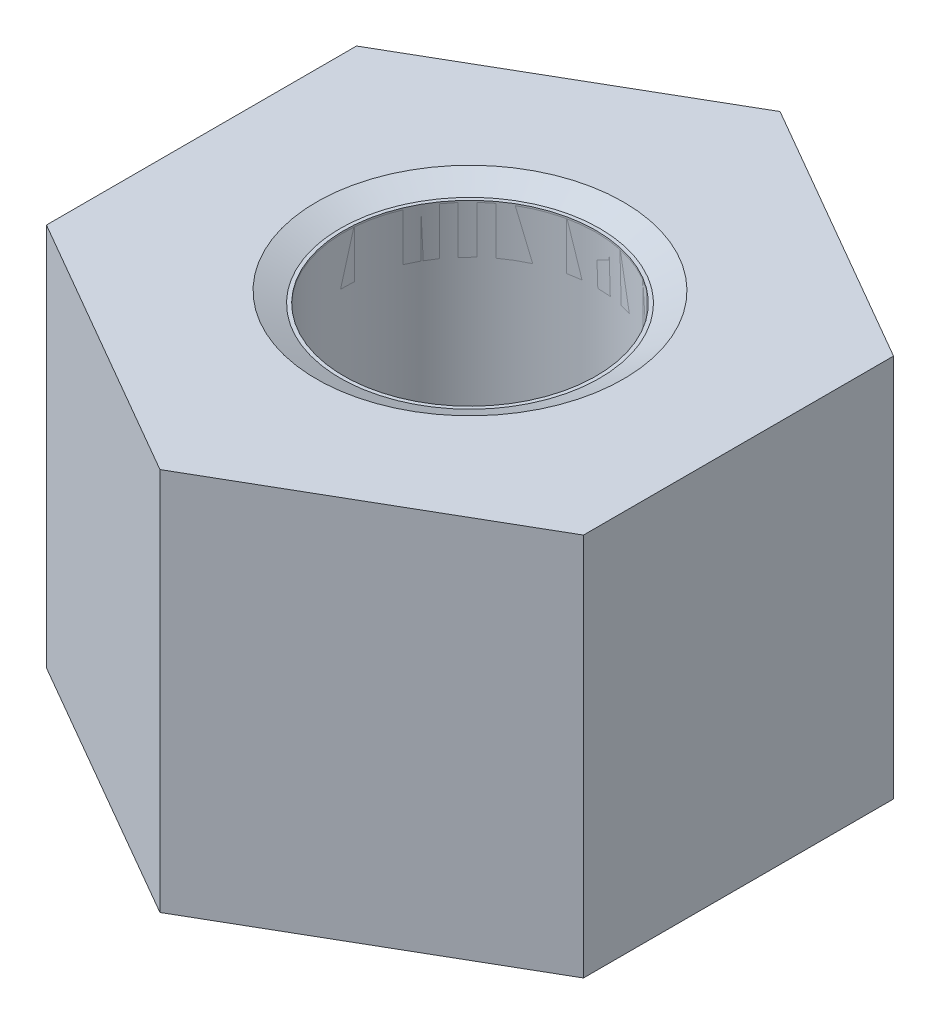
ISO-10303-21;
HEADER;
FILE_DESCRIPTION(('STEP AP214'),'2;1');
FILE_NAME('part.step','',(''),(''),'','','');
FILE_SCHEMA(('AUTOMOTIVE_DESIGN { 1 0 10303 214 1 1 1 1 }'));
ENDSEC;
DATA;
#1=APPLICATION_CONTEXT('core data for automotive mechanical design processes');
#2=APPLICATION_PROTOCOL_DEFINITION('international standard','automotive_design',2000,#1);
#3=PRODUCT_CONTEXT('',#1,'mechanical');
#4=PRODUCT('Part','Part','',(#3));
#5=PRODUCT_RELATED_PRODUCT_CATEGORY('part','',(#4));
#6=PRODUCT_DEFINITION_FORMATION('','',#4);
#7=PRODUCT_DEFINITION_CONTEXT('part definition',#1,'design');
#8=PRODUCT_DEFINITION('design','',#6,#7);
#9=PRODUCT_DEFINITION_SHAPE('','',#8);
#10=(LENGTH_UNIT() NAMED_UNIT(*) SI_UNIT(.MILLI.,.METRE.));
#11=(NAMED_UNIT(*) PLANE_ANGLE_UNIT() SI_UNIT($,.RADIAN.));
#12=(NAMED_UNIT(*) SI_UNIT($,.STERADIAN.) SOLID_ANGLE_UNIT());
#13=UNCERTAINTY_MEASURE_WITH_UNIT(LENGTH_MEASURE(1.E-05),#10,'distance_accuracy_value','');
#14=(GEOMETRIC_REPRESENTATION_CONTEXT(3) GLOBAL_UNCERTAINTY_ASSIGNED_CONTEXT((#13)) GLOBAL_UNIT_ASSIGNED_CONTEXT((#10,
#11,#12)) REPRESENTATION_CONTEXT('',''));
#15=CARTESIAN_POINT('',(0.,0.,0.));
#16=DIRECTION('',(0.,0.,1.));
#17=DIRECTION('',(1.,0.,0.));
#18=AXIS2_PLACEMENT_3D('',#15,#16,#17);
#19=CARTESIAN_POINT('',(0.,6.69078333333333,0.));
#20=DIRECTION('',(0.,-1.,0.));
#21=DIRECTION('',(0.,0.,-1.));
#22=AXIS2_PLACEMENT_3D('',#19,#20,#21);
#23=CYLINDRICAL_SURFACE('',#22,2.60990835569695);
#24=CARTESIAN_POINT('',(0.,6.69078333333333,0.));
#25=DIRECTION('',(0.,-1.,0.));
#26=DIRECTION('',(0.,0.,-1.));
#27=AXIS2_PLACEMENT_3D('',#24,#25,#26);
#28=CIRCLE('',#27,2.60990835569695);
#29=CARTESIAN_POINT('',(0.,6.69078333333333,-2.60990835569695));
#30=VERTEX_POINT('',#29);
#31=EDGE_CURVE('E11',#30,#30,#28,.T.);
#32=ORIENTED_EDGE('',*,*,#31,.T.);
#33=EDGE_LOOP('',(#32));
#34=FACE_BOUND('',#33,.T.);
#35=CARTESIAN_POINT('',(0.,7.7089,0.));
#36=DIRECTION('',(0.,-1.,0.));
#37=DIRECTION('',(0.,0.,-1.));
#38=AXIS2_PLACEMENT_3D('',#35,#36,#37);
#39=CIRCLE('',#38,2.60990835569695);
#40=CARTESIAN_POINT('',(0.,7.7089,-2.60990835569695));
#41=VERTEX_POINT('',#40);
#42=EDGE_CURVE('E61',#41,#41,#39,.T.);
#43=ORIENTED_EDGE('',*,*,#42,.F.);
#44=EDGE_LOOP('',(#43));
#45=FACE_BOUND('',#44,.T.);
#46=ADVANCED_FACE('F47',(#34,#45),#23,.F.);
#47=CARTESIAN_POINT('',(0.,6.69078333333333,-2.60990835569695));
#48=DIRECTION('',(0.,-1.,0.));
#49=DIRECTION('',(0.,0.,-1.));
#50=AXIS2_PLACEMENT_3D('',#47,#48,#49);
#51=PLANE('',#50);
#52=CARTESIAN_POINT('',(0.,6.69078333333333,0.));
#53=DIRECTION('',(0.,-1.,0.));
#54=DIRECTION('',(0.,0.,-1.));
#55=AXIS2_PLACEMENT_3D('',#52,#53,#54);
#56=CIRCLE('',#55,5.32499377822654);
#57=CARTESIAN_POINT('',(0.,6.69078333333333,-5.32499377822654));
#58=VERTEX_POINT('',#57);
#59=EDGE_CURVE('E53',#58,#58,#56,.T.);
#60=ORIENTED_EDGE('',*,*,#59,.T.);
#61=EDGE_LOOP('',(#60));
#62=FACE_BOUND('',#61,.T.);
#63=ORIENTED_EDGE('',*,*,#31,.F.);
#64=EDGE_LOOP('',(#63));
#65=FACE_BOUND('',#64,.T.);
#66=ADVANCED_FACE('F71',(#62,#65),#51,.T.);
#67=CARTESIAN_POINT('',(0.,6.61458333333333,0.));
#68=DIRECTION('',(0.,-1.,0.));
#69=DIRECTION('',(0.,0.,-1.));
#70=AXIS2_PLACEMENT_3D('',#67,#68,#69);
#71=TOROIDAL_SURFACE('',#70,4.23333333333333,1.09431666666667);
#72=CARTESIAN_POINT('',(0.,7.7089,0.));
#73=DIRECTION('',(0.,-1.,0.));
#74=DIRECTION('',(0.,0.,-1.));
#75=AXIS2_PLACEMENT_3D('',#72,#73,#74);
#76=CIRCLE('',#75,4.23333333333333);
#77=CARTESIAN_POINT('',(0.,7.7089,-4.23333333333333));
#78=VERTEX_POINT('',#77);
#79=EDGE_CURVE('E57',#78,#78,#76,.T.);
#80=ORIENTED_EDGE('',*,*,#79,.T.);
#81=EDGE_LOOP('',(#80));
#82=FACE_BOUND('',#81,.T.);
#83=ORIENTED_EDGE('',*,*,#59,.F.);
#84=EDGE_LOOP('',(#83));
#85=FACE_BOUND('',#84,.T.);
#86=ADVANCED_FACE('F75',(#82,#85),#71,.T.);
#87=CARTESIAN_POINT('',(0.,7.7089,-4.23333333333333));
#88=DIRECTION('',(0.,1.,0.));
#89=DIRECTION('',(0.,0.,1.));
#90=AXIS2_PLACEMENT_3D('',#87,#88,#89);
#91=PLANE('',#90);
#92=ORIENTED_EDGE('',*,*,#42,.T.);
#93=EDGE_LOOP('',(#92));
#94=FACE_BOUND('',#93,.T.);
#95=ORIENTED_EDGE('',*,*,#79,.F.);
#96=EDGE_LOOP('',(#95));
#97=FACE_BOUND('',#96,.T.);
#98=ADVANCED_FACE('F67',(#94,#97),#91,.T.);
#99=CLOSED_SHELL('',(#46,#66,#86,#98));
#100=MANIFOLD_SOLID_BREP('B2',#99);
#101=CARTESIAN_POINT('',(5.55625,7.9375,-3.20790243318486));
#102=DIRECTION('',(-0.5,0.,0.866025403784439));
#103=DIRECTION('',(0.866025403784439,0.,0.5));
#104=AXIS2_PLACEMENT_3D('',#101,#102,#103);
#105=PLANE('',#104);
#106=DIRECTION('',(-0.866025403784439,0.,-0.5));
#107=VECTOR('',#106,1.);
#108=CARTESIAN_POINT('',(5.55625,0.,-3.20790243318486));
#109=LINE('',#108,#107);
#110=CARTESIAN_POINT('',(5.55625,0.,-3.20790243318486));
#111=VERTEX_POINT('',#110);
#112=CARTESIAN_POINT('',(0.,0.,-6.41580486636972));
#113=VERTEX_POINT('',#112);
#114=EDGE_CURVE('E198',#111,#113,#109,.T.);
#115=ORIENTED_EDGE('',*,*,#114,.T.);
#116=DIRECTION('',(0.,-1.,0.));
#117=VECTOR('',#116,1.);
#118=CARTESIAN_POINT('',(0.,7.9375,-6.41580486636972));
#119=LINE('',#118,#117);
#120=CARTESIAN_POINT('',(0.,7.9375,-6.41580486636972));
#121=VERTEX_POINT('',#120);
#122=EDGE_CURVE('E45',#121,#113,#119,.T.);
#123=ORIENTED_EDGE('',*,*,#122,.F.);
#124=DIRECTION('',(-0.866025403784439,0.,-0.5));
#125=VECTOR('',#124,1.);
#126=CARTESIAN_POINT('',(5.55625,7.9375,-3.20790243318486));
#127=LINE('',#126,#125);
#128=CARTESIAN_POINT('',(5.55625,7.9375,-3.20790243318486));
#129=VERTEX_POINT('',#128);
#130=EDGE_CURVE('E215',#129,#121,#127,.T.);
#131=ORIENTED_EDGE('',*,*,#130,.F.);
#132=DIRECTION('',(0.,-1.,0.));
#133=VECTOR('',#132,1.);
#134=CARTESIAN_POINT('',(5.55625,7.9375,-3.20790243318486));
#135=LINE('',#134,#133);
#136=EDGE_CURVE('E194',#129,#111,#135,.T.);
#137=ORIENTED_EDGE('',*,*,#136,.T.);
#138=EDGE_LOOP('',(#115,#123,#131,#137));
#139=FACE_BOUND('',#138,.T.);
#140=ADVANCED_FACE('F109',(#139),#105,.F.);
#141=CARTESIAN_POINT('',(0.,7.9375,-6.41580486636972));
#142=DIRECTION('',(0.5,0.,0.866025403784439));
#143=DIRECTION('',(0.866025403784439,0.,-0.5));
#144=AXIS2_PLACEMENT_3D('',#141,#142,#143);
#145=PLANE('',#144);
#146=DIRECTION('',(-0.866025403784439,0.,0.5));
#147=VECTOR('',#146,1.);
#148=CARTESIAN_POINT('',(0.,0.,-6.41580486636972));
#149=LINE('',#148,#147);
#150=CARTESIAN_POINT('',(-5.55625,0.,-3.20790243318486));
#151=VERTEX_POINT('',#150);
#152=EDGE_CURVE('E202',#113,#151,#149,.T.);
#153=ORIENTED_EDGE('',*,*,#152,.T.);
#154=DIRECTION('',(0.,-1.,0.));
#155=VECTOR('',#154,1.);
#156=CARTESIAN_POINT('',(-5.55625,7.9375,-3.20790243318486));
#157=LINE('',#156,#155);
#158=CARTESIAN_POINT('',(-5.55625,7.9375,-3.20790243318486));
#159=VERTEX_POINT('',#158);
#160=EDGE_CURVE('E118',#159,#151,#157,.T.);
#161=ORIENTED_EDGE('',*,*,#160,.F.);
#162=DIRECTION('',(-0.866025403784439,0.,0.5));
#163=VECTOR('',#162,1.);
#164=CARTESIAN_POINT('',(0.,7.9375,-6.41580486636972));
#165=LINE('',#164,#163);
#166=EDGE_CURVE('E163',#121,#159,#165,.T.);
#167=ORIENTED_EDGE('',*,*,#166,.F.);
#168=ORIENTED_EDGE('',*,*,#122,.T.);
#169=EDGE_LOOP('',(#153,#161,#167,#168));
#170=FACE_BOUND('',#169,.T.);
#171=ADVANCED_FACE('F244',(#170),#145,.F.);
#172=CARTESIAN_POINT('',(-5.55625,7.9375,-3.20790243318486));
#173=DIRECTION('',(1.,0.,0.));
#174=DIRECTION('',(0.,0.,-1.));
#175=AXIS2_PLACEMENT_3D('',#172,#173,#174);
#176=PLANE('',#175);
#177=DIRECTION('',(0.,0.,1.));
#178=VECTOR('',#177,1.);
#179=CARTESIAN_POINT('',(-5.55625,0.,-3.20790243318486));
#180=LINE('',#179,#178);
#181=CARTESIAN_POINT('',(-5.55625,0.,3.20790243318486));
#182=VERTEX_POINT('',#181);
#183=EDGE_CURVE('E206',#151,#182,#180,.T.);
#184=ORIENTED_EDGE('',*,*,#183,.T.);
#185=DIRECTION('',(0.,-1.,0.));
#186=VECTOR('',#185,1.);
#187=CARTESIAN_POINT('',(-5.55625,7.9375,3.20790243318486));
#188=LINE('',#187,#186);
#189=CARTESIAN_POINT('',(-5.55625,7.9375,3.20790243318486));
#190=VERTEX_POINT('',#189);
#191=EDGE_CURVE('E187',#190,#182,#188,.T.);
#192=ORIENTED_EDGE('',*,*,#191,.F.);
#193=DIRECTION('',(0.,0.,1.));
#194=VECTOR('',#193,1.);
#195=CARTESIAN_POINT('',(-5.55625,7.9375,-3.20790243318486));
#196=LINE('',#195,#194);
#197=EDGE_CURVE('E176',#159,#190,#196,.T.);
#198=ORIENTED_EDGE('',*,*,#197,.F.);
#199=ORIENTED_EDGE('',*,*,#160,.T.);
#200=EDGE_LOOP('',(#184,#192,#198,#199));
#201=FACE_BOUND('',#200,.T.);
#202=ADVANCED_FACE('F225',(#201),#176,.F.);
#203=CARTESIAN_POINT('',(-5.55625,7.9375,3.20790243318486));
#204=DIRECTION('',(0.5,0.,-0.866025403784438));
#205=DIRECTION('',(-0.866025403784439,0.,-0.5));
#206=AXIS2_PLACEMENT_3D('',#203,#204,#205);
#207=PLANE('',#206);
#208=DIRECTION('',(0.866025403784438,0.,0.5));
#209=VECTOR('',#208,1.);
#210=CARTESIAN_POINT('',(-5.55625,0.,3.20790243318486));
#211=LINE('',#210,#209);
#212=CARTESIAN_POINT('',(0.,0.,6.41580486636972));
#213=VERTEX_POINT('',#212);
#214=EDGE_CURVE('E185',#182,#213,#211,.T.);
#215=ORIENTED_EDGE('',*,*,#214,.T.);
#216=DIRECTION('',(0.,-1.,0.));
#217=VECTOR('',#216,1.);
#218=CARTESIAN_POINT('',(0.,7.9375,6.41580486636972));
#219=LINE('',#218,#217);
#220=CARTESIAN_POINT('',(0.,7.9375,6.41580486636972));
#221=VERTEX_POINT('',#220);
#222=EDGE_CURVE('E182',#221,#213,#219,.T.);
#223=ORIENTED_EDGE('',*,*,#222,.F.);
#224=DIRECTION('',(0.866025403784438,0.,0.5));
#225=VECTOR('',#224,1.);
#226=CARTESIAN_POINT('',(-5.55625,7.9375,3.20790243318486));
#227=LINE('',#226,#225);
#228=EDGE_CURVE('E170',#190,#221,#227,.T.);
#229=ORIENTED_EDGE('',*,*,#228,.F.);
#230=ORIENTED_EDGE('',*,*,#191,.T.);
#231=EDGE_LOOP('',(#215,#223,#229,#230));
#232=FACE_BOUND('',#231,.T.);
#233=ADVANCED_FACE('F183',(#232),#207,.F.);
#234=CARTESIAN_POINT('',(0.,7.9375,6.41580486636972));
#235=DIRECTION('',(-0.5,0.,-0.866025403784439));
#236=DIRECTION('',(-0.866025403784439,0.,0.5));
#237=AXIS2_PLACEMENT_3D('',#234,#235,#236);
#238=PLANE('',#237);
#239=DIRECTION('',(0.866025403784439,0.,-0.5));
#240=VECTOR('',#239,1.);
#241=CARTESIAN_POINT('',(0.,0.,6.41580486636972));
#242=LINE('',#241,#240);
#243=CARTESIAN_POINT('',(5.55625,0.,3.20790243318486));
#244=VERTEX_POINT('',#243);
#245=EDGE_CURVE('E149',#213,#244,#242,.T.);
#246=ORIENTED_EDGE('',*,*,#245,.T.);
#247=DIRECTION('',(0.,-1.,0.));
#248=VECTOR('',#247,1.);
#249=CARTESIAN_POINT('',(5.55625,7.9375,3.20790243318486));
#250=LINE('',#249,#248);
#251=CARTESIAN_POINT('',(5.55625,7.9375,3.20790243318486));
#252=VERTEX_POINT('',#251);
#253=EDGE_CURVE('E188',#252,#244,#250,.T.);
#254=ORIENTED_EDGE('',*,*,#253,.F.);
#255=DIRECTION('',(0.866025403784439,0.,-0.5));
#256=VECTOR('',#255,1.);
#257=CARTESIAN_POINT('',(0.,7.9375,6.41580486636972));
#258=LINE('',#257,#256);
#259=EDGE_CURVE('E174',#221,#252,#258,.T.);
#260=ORIENTED_EDGE('',*,*,#259,.F.);
#261=ORIENTED_EDGE('',*,*,#222,.T.);
#262=EDGE_LOOP('',(#246,#254,#260,#261));
#263=FACE_BOUND('',#262,.T.);
#264=ADVANCED_FACE('F190',(#263),#238,.F.);
#265=CARTESIAN_POINT('',(5.55625,7.9375,3.20790243318486));
#266=DIRECTION('',(-1.,0.,0.));
#267=DIRECTION('',(0.,0.,1.));
#268=AXIS2_PLACEMENT_3D('',#265,#266,#267);
#269=PLANE('',#268);
#270=DIRECTION('',(0.,0.,-1.));
#271=VECTOR('',#270,1.);
#272=CARTESIAN_POINT('',(5.55625,0.,3.20790243318486));
#273=LINE('',#272,#271);
#274=EDGE_CURVE('E155',#244,#111,#273,.T.);
#275=ORIENTED_EDGE('',*,*,#274,.T.);
#276=ORIENTED_EDGE('',*,*,#136,.F.);
#277=DIRECTION('',(0.,0.,-1.));
#278=VECTOR('',#277,1.);
#279=CARTESIAN_POINT('',(5.55625,7.9375,3.20790243318486));
#280=LINE('',#279,#278);
#281=EDGE_CURVE('E126',#252,#129,#280,.T.);
#282=ORIENTED_EDGE('',*,*,#281,.F.);
#283=ORIENTED_EDGE('',*,*,#253,.T.);
#284=EDGE_LOOP('',(#275,#276,#282,#283));
#285=FACE_BOUND('',#284,.T.);
#286=ADVANCED_FACE('F232',(#285),#269,.F.);
#287=CARTESIAN_POINT('',(-5.55625,7.9375,-9.62370729955458));
#288=DIRECTION('',(0.,1.,0.));
#289=DIRECTION('',(0.,0.,1.));
#290=AXIS2_PLACEMENT_3D('',#287,#288,#289);
#291=PLANE('',#290);
#292=CARTESIAN_POINT('',(0.,7.9375,0.));
#293=DIRECTION('',(0.,-1.,0.));
#294=DIRECTION('',(0.,0.,-1.));
#295=AXIS2_PLACEMENT_3D('',#292,#293,#294);
#296=CIRCLE('',#295,3.175);
#297=CARTESIAN_POINT('',(0.,7.9375,-3.175));
#298=VERTEX_POINT('',#297);
#299=EDGE_CURVE('E203',#298,#298,#296,.T.);
#300=ORIENTED_EDGE('',*,*,#299,.T.);
#301=EDGE_LOOP('',(#300));
#302=FACE_BOUND('',#301,.T.);
#303=ORIENTED_EDGE('',*,*,#130,.T.);
#304=ORIENTED_EDGE('',*,*,#166,.T.);
#305=ORIENTED_EDGE('',*,*,#197,.T.);
#306=ORIENTED_EDGE('',*,*,#228,.T.);
#307=ORIENTED_EDGE('',*,*,#259,.T.);
#308=ORIENTED_EDGE('',*,*,#281,.T.);
#309=EDGE_LOOP('',(#303,#304,#305,#306,#307,#308));
#310=FACE_BOUND('',#309,.T.);
#311=ADVANCED_FACE('F172',(#302,#310),#291,.T.);
#312=CARTESIAN_POINT('',(-5.55625,0.,-9.62370729955458));
#313=DIRECTION('',(0.,1.,0.));
#314=DIRECTION('',(0.,0.,1.));
#315=AXIS2_PLACEMENT_3D('',#312,#313,#314);
#316=PLANE('',#315);
#317=CARTESIAN_POINT('',(0.,0.,0.));
#318=DIRECTION('',(0.,-1.,0.));
#319=DIRECTION('',(0.,0.,-1.));
#320=AXIS2_PLACEMENT_3D('',#317,#318,#319);
#321=CIRCLE('',#320,3.175);
#322=CARTESIAN_POINT('',(0.,0.,-3.175));
#323=VERTEX_POINT('',#322);
#324=EDGE_CURVE('E320',#323,#323,#321,.T.);
#325=ORIENTED_EDGE('',*,*,#324,.F.);
#326=EDGE_LOOP('',(#325));
#327=FACE_BOUND('',#326,.T.);
#328=ORIENTED_EDGE('',*,*,#114,.F.);
#329=ORIENTED_EDGE('',*,*,#274,.F.);
#330=ORIENTED_EDGE('',*,*,#245,.F.);
#331=ORIENTED_EDGE('',*,*,#214,.F.);
#332=ORIENTED_EDGE('',*,*,#183,.F.);
#333=ORIENTED_EDGE('',*,*,#152,.F.);
#334=EDGE_LOOP('',(#328,#329,#330,#331,#332,#333));
#335=FACE_BOUND('',#334,.T.);
#336=ADVANCED_FACE('F228',(#327,#335),#316,.F.);
#337=CARTESIAN_POINT('',(0.,7.67399343870209,0.));
#338=DIRECTION('',(0.,1.,0.));
#339=DIRECTION('',(0.,0.,1.));
#340=AXIS2_PLACEMENT_3D('',#337,#338,#339);
#341=CONICAL_SURFACE('',#340,2.60990835569695,1.13446401379632);
#342=ORIENTED_EDGE('',*,*,#299,.F.);
#343=EDGE_LOOP('',(#342));
#344=FACE_BOUND('',#343,.T.);
#345=CARTESIAN_POINT('',(0.,7.67399343870209,0.));
#346=DIRECTION('',(0.,-1.,0.));
#347=DIRECTION('',(0.,0.,-1.));
#348=AXIS2_PLACEMENT_3D('',#345,#346,#347);
#349=CIRCLE('',#348,2.60990835569695);
#350=CARTESIAN_POINT('',(0.,7.67399343870209,-2.60990835569695));
#351=VERTEX_POINT('',#350);
#352=EDGE_CURVE('E324',#351,#351,#349,.T.);
#353=ORIENTED_EDGE('',*,*,#352,.T.);
#354=EDGE_LOOP('',(#353));
#355=FACE_BOUND('',#354,.T.);
#356=ADVANCED_FACE('F281',(#344,#355),#341,.F.);
#357=CARTESIAN_POINT('',(0.,7.9375,0.));
#358=DIRECTION('',(0.,-1.,0.));
#359=DIRECTION('',(0.,0.,-1.));
#360=AXIS2_PLACEMENT_3D('',#357,#358,#359);
#361=CYLINDRICAL_SURFACE('',#360,2.60990835569695);
#362=ORIENTED_EDGE('',*,*,#352,.F.);
#363=EDGE_LOOP('',(#362));
#364=FACE_BOUND('',#363,.T.);
#365=CARTESIAN_POINT('',(0.,0.263506561297913,0.));
#366=DIRECTION('',(0.,-1.,0.));
#367=DIRECTION('',(0.,0.,-1.));
#368=AXIS2_PLACEMENT_3D('',#365,#366,#367);
#369=CIRCLE('',#368,2.60990835569695);
#370=CARTESIAN_POINT('',(0.,0.263506561297913,-2.60990835569695));
#371=VERTEX_POINT('',#370);
#372=EDGE_CURVE('E317',#371,#371,#369,.T.);
#373=ORIENTED_EDGE('',*,*,#372,.T.);
#374=EDGE_LOOP('',(#373));
#375=FACE_BOUND('',#374,.T.);
#376=ADVANCED_FACE('F290',(#364,#375),#361,.F.);
#377=CARTESIAN_POINT('',(0.,0.,0.));
#378=DIRECTION('',(0.,-1.,0.));
#379=DIRECTION('',(0.,0.,-1.));
#380=AXIS2_PLACEMENT_3D('',#377,#378,#379);
#381=CONICAL_SURFACE('',#380,3.175,1.13446401379632);
#382=ORIENTED_EDGE('',*,*,#372,.F.);
#383=EDGE_LOOP('',(#382));
#384=FACE_BOUND('',#383,.T.);
#385=ORIENTED_EDGE('',*,*,#324,.T.);
#386=EDGE_LOOP('',(#385));
#387=FACE_BOUND('',#386,.T.);
#388=ADVANCED_FACE('F300',(#384,#387),#381,.F.);
#389=CLOSED_SHELL('',(#140,#171,#202,#233,#264,#286,#311,#336,#356,#376,#388));
#390=MANIFOLD_SOLID_BREP('B6',#389);
#391=ADVANCED_BREP_SHAPE_REPRESENTATION('',(#18,#100,#390),#14);
#392=SHAPE_DEFINITION_REPRESENTATION(#9,#391);
ENDSEC;
END-ISO-10303-21;
